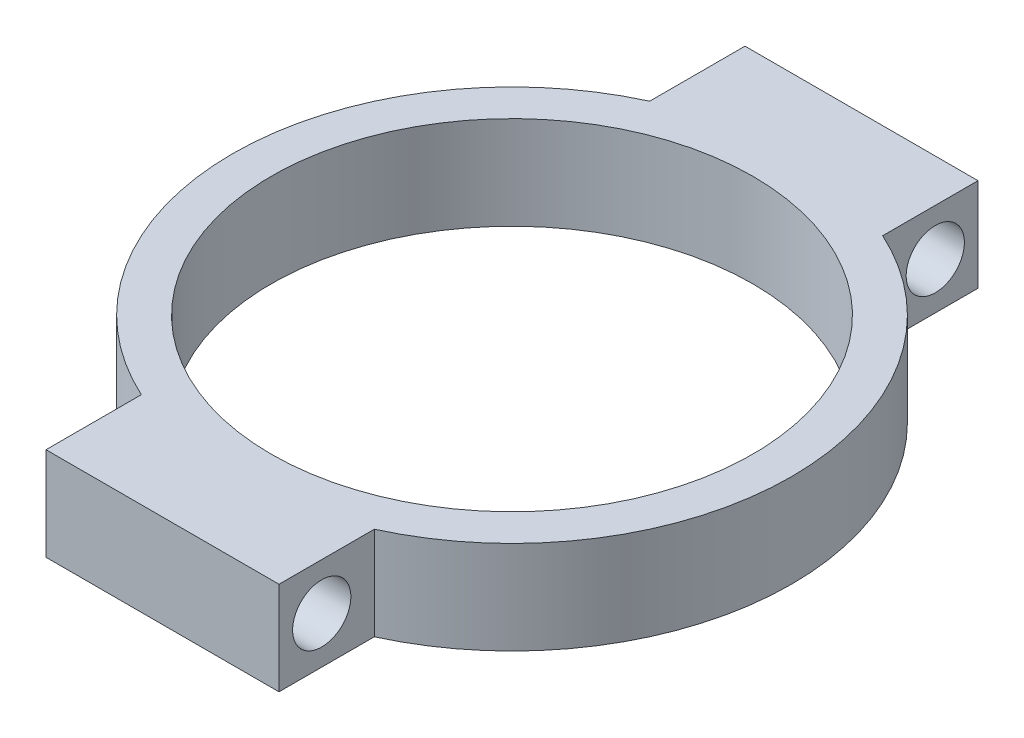
ISO-10303-21;
HEADER;
FILE_DESCRIPTION(('STEP AP214'),'2;1');
FILE_NAME('part.step','',(''),(''),'','','');
FILE_SCHEMA(('AUTOMOTIVE_DESIGN { 1 0 10303 214 1 1 1 1 }'));
ENDSEC;
DATA;
#1=APPLICATION_CONTEXT('core data for automotive mechanical design processes');
#2=APPLICATION_PROTOCOL_DEFINITION('international standard','automotive_design',2000,#1);
#3=PRODUCT_CONTEXT('',#1,'mechanical');
#4=PRODUCT('Part','Part','',(#3));
#5=PRODUCT_RELATED_PRODUCT_CATEGORY('part','',(#4));
#6=PRODUCT_DEFINITION_FORMATION('','',#4);
#7=PRODUCT_DEFINITION_CONTEXT('part definition',#1,'design');
#8=PRODUCT_DEFINITION('design','',#6,#7);
#9=PRODUCT_DEFINITION_SHAPE('','',#8);
#10=(LENGTH_UNIT() NAMED_UNIT(*) SI_UNIT(.MILLI.,.METRE.));
#11=(NAMED_UNIT(*) PLANE_ANGLE_UNIT() SI_UNIT($,.RADIAN.));
#12=(NAMED_UNIT(*) SI_UNIT($,.STERADIAN.) SOLID_ANGLE_UNIT());
#13=UNCERTAINTY_MEASURE_WITH_UNIT(LENGTH_MEASURE(1.E-05),#10,'distance_accuracy_value','');
#14=(GEOMETRIC_REPRESENTATION_CONTEXT(3) GLOBAL_UNCERTAINTY_ASSIGNED_CONTEXT((#13)) GLOBAL_UNIT_ASSIGNED_CONTEXT((#10,
#11,#12)) REPRESENTATION_CONTEXT('',''));
#15=CARTESIAN_POINT('',(0.,0.,0.));
#16=DIRECTION('',(0.,0.,1.));
#17=DIRECTION('',(1.,0.,0.));
#18=AXIS2_PLACEMENT_3D('',#15,#16,#17);
#19=CARTESIAN_POINT('',(0.,15.24,0.));
#20=DIRECTION('',(0.,-1.,0.));
#21=DIRECTION('',(0.,0.,-1.));
#22=AXIS2_PLACEMENT_3D('',#19,#20,#21);
#23=CYLINDRICAL_SURFACE('',#22,45.72);
#24=CARTESIAN_POINT('',(0.,0.,0.));
#25=DIRECTION('',(0.,1.,0.));
#26=DIRECTION('',(0.,0.,1.));
#27=AXIS2_PLACEMENT_3D('',#24,#25,#26);
#28=CIRCLE('',#27,45.72);
#29=CARTESIAN_POINT('',(19.05,0.,-41.5621931567621));
#30=VERTEX_POINT('',#29);
#31=CARTESIAN_POINT('',(19.05,0.,41.5621931567621));
#32=VERTEX_POINT('',#31);
#33=EDGE_CURVE('E132',#30,#32,#28,.F.);
#34=ORIENTED_EDGE('',*,*,#33,.F.);
#35=DIRECTION('',(0.,-1.,0.));
#36=VECTOR('',#35,1.);
#37=CARTESIAN_POINT('',(19.05,15.24,-41.5621931567621));
#38=LINE('',#37,#36);
#39=CARTESIAN_POINT('',(19.05,15.24,-41.5621931567621));
#40=VERTEX_POINT('',#39);
#41=EDGE_CURVE('E11',#40,#30,#38,.T.);
#42=ORIENTED_EDGE('',*,*,#41,.F.);
#43=CARTESIAN_POINT('',(0.,15.24,0.));
#44=DIRECTION('',(0.,1.,0.));
#45=DIRECTION('',(0.,0.,1.));
#46=AXIS2_PLACEMENT_3D('',#43,#44,#45);
#47=CIRCLE('',#46,45.72);
#48=CARTESIAN_POINT('',(19.05,15.24,41.5621931567621));
#49=VERTEX_POINT('',#48);
#50=EDGE_CURVE('E153',#40,#49,#47,.F.);
#51=ORIENTED_EDGE('',*,*,#50,.T.);
#52=DIRECTION('',(0.,-1.,0.));
#53=VECTOR('',#52,1.);
#54=CARTESIAN_POINT('',(19.05,15.24,41.5621931567621));
#55=LINE('',#54,#53);
#56=EDGE_CURVE('E85',#49,#32,#55,.T.);
#57=ORIENTED_EDGE('',*,*,#56,.T.);
#58=EDGE_LOOP('',(#34,#42,#51,#57));
#59=FACE_BOUND('',#58,.T.);
#60=ADVANCED_FACE('F34',(#59),#23,.T.);
#61=CARTESIAN_POINT('',(19.05,15.24,0.));
#62=DIRECTION('',(1.,0.,0.));
#63=DIRECTION('',(0.,0.,-1.));
#64=AXIS2_PLACEMENT_3D('',#61,#62,#63);
#65=PLANE('',#64);
#66=CARTESIAN_POINT('',(19.05,7.61999999999999,-50.165));
#67=DIRECTION('',(1.,0.,0.));
#68=DIRECTION('',(0.,0.,-1.));
#69=AXIS2_PLACEMENT_3D('',#66,#67,#68);
#70=CIRCLE('',#69,4.7625);
#71=CARTESIAN_POINT('',(19.05,7.61999999999999,-54.9275));
#72=VERTEX_POINT('',#71);
#73=EDGE_CURVE('E195',#72,#72,#70,.T.);
#74=ORIENTED_EDGE('',*,*,#73,.F.);
#75=EDGE_LOOP('',(#74));
#76=FACE_BOUND('',#75,.T.);
#77=DIRECTION('',(0.,0.,1.));
#78=VECTOR('',#77,1.);
#79=CARTESIAN_POINT('',(19.05,0.,0.));
#80=LINE('',#79,#78);
#81=CARTESIAN_POINT('',(19.05,0.,-57.15));
#82=VERTEX_POINT('',#81);
#83=EDGE_CURVE('E135',#82,#30,#80,.T.);
#84=ORIENTED_EDGE('',*,*,#83,.F.);
#85=DIRECTION('',(0.,-1.,0.));
#86=VECTOR('',#85,1.);
#87=CARTESIAN_POINT('',(19.05,15.24,-57.15));
#88=LINE('',#87,#86);
#89=CARTESIAN_POINT('',(19.05,15.24,-57.15));
#90=VERTEX_POINT('',#89);
#91=EDGE_CURVE('E43',#90,#82,#88,.T.);
#92=ORIENTED_EDGE('',*,*,#91,.F.);
#93=DIRECTION('',(0.,0.,1.));
#94=VECTOR('',#93,1.);
#95=CARTESIAN_POINT('',(19.05,15.24,0.));
#96=LINE('',#95,#94);
#97=EDGE_CURVE('E187',#90,#40,#96,.T.);
#98=ORIENTED_EDGE('',*,*,#97,.T.);
#99=ORIENTED_EDGE('',*,*,#41,.T.);
#100=EDGE_LOOP('',(#84,#92,#98,#99));
#101=FACE_BOUND('',#100,.T.);
#102=ADVANCED_FACE('F172',(#76,#101),#65,.T.);
#103=CARTESIAN_POINT('',(0.,15.24,-57.15));
#104=DIRECTION('',(0.,0.,-1.));
#105=DIRECTION('',(-1.,0.,0.));
#106=AXIS2_PLACEMENT_3D('',#103,#104,#105);
#107=PLANE('',#106);
#108=DIRECTION('',(1.,0.,0.));
#109=VECTOR('',#108,1.);
#110=CARTESIAN_POINT('',(0.,0.,-57.15));
#111=LINE('',#110,#109);
#112=CARTESIAN_POINT('',(-19.05,0.,-57.15));
#113=VERTEX_POINT('',#112);
#114=EDGE_CURVE('E138',#113,#82,#111,.T.);
#115=ORIENTED_EDGE('',*,*,#114,.F.);
#116=DIRECTION('',(0.,-1.,0.));
#117=VECTOR('',#116,1.);
#118=CARTESIAN_POINT('',(-19.05,15.24,-57.15));
#119=LINE('',#118,#117);
#120=CARTESIAN_POINT('',(-19.05,15.24,-57.15));
#121=VERTEX_POINT('',#120);
#122=EDGE_CURVE('E160',#121,#113,#119,.T.);
#123=ORIENTED_EDGE('',*,*,#122,.F.);
#124=DIRECTION('',(1.,0.,0.));
#125=VECTOR('',#124,1.);
#126=CARTESIAN_POINT('',(0.,15.24,-57.15));
#127=LINE('',#126,#125);
#128=EDGE_CURVE('E168',#121,#90,#127,.T.);
#129=ORIENTED_EDGE('',*,*,#128,.T.);
#130=ORIENTED_EDGE('',*,*,#91,.T.);
#131=EDGE_LOOP('',(#115,#123,#129,#130));
#132=FACE_BOUND('',#131,.T.);
#133=ADVANCED_FACE('F166',(#132),#107,.T.);
#134=CARTESIAN_POINT('',(-19.0499999999999,15.24,0.));
#135=DIRECTION('',(1.,0.,0.));
#136=DIRECTION('',(0.,0.,-1.));
#137=AXIS2_PLACEMENT_3D('',#134,#135,#136);
#138=PLANE('',#137);
#139=CARTESIAN_POINT('',(-19.05,7.61999999999999,-50.165));
#140=DIRECTION('',(-1.,0.,0.));
#141=DIRECTION('',(0.,0.,1.));
#142=AXIS2_PLACEMENT_3D('',#139,#140,#141);
#143=CIRCLE('',#142,4.7625);
#144=CARTESIAN_POINT('',(-19.05,7.61999999999999,-45.4025));
#145=VERTEX_POINT('',#144);
#146=EDGE_CURVE('E198',#145,#145,#143,.T.);
#147=ORIENTED_EDGE('',*,*,#146,.F.);
#148=EDGE_LOOP('',(#147));
#149=FACE_BOUND('',#148,.T.);
#150=DIRECTION('',(0.,0.,1.));
#151=VECTOR('',#150,1.);
#152=CARTESIAN_POINT('',(-19.0499999999999,0.,0.));
#153=LINE('',#152,#151);
#154=CARTESIAN_POINT('',(-19.05,0.,-41.5621931567621));
#155=VERTEX_POINT('',#154);
#156=EDGE_CURVE('E141',#113,#155,#153,.T.);
#157=ORIENTED_EDGE('',*,*,#156,.T.);
#158=DIRECTION('',(0.,-1.,0.));
#159=VECTOR('',#158,1.);
#160=CARTESIAN_POINT('',(-19.05,15.24,-41.5621931567621));
#161=LINE('',#160,#159);
#162=CARTESIAN_POINT('',(-19.05,15.24,-41.5621931567621));
#163=VERTEX_POINT('',#162);
#164=EDGE_CURVE('E157',#163,#155,#161,.T.);
#165=ORIENTED_EDGE('',*,*,#164,.F.);
#166=DIRECTION('',(0.,0.,1.));
#167=VECTOR('',#166,1.);
#168=CARTESIAN_POINT('',(-19.0499999999999,15.24,0.));
#169=LINE('',#168,#167);
#170=EDGE_CURVE('E124',#121,#163,#169,.T.);
#171=ORIENTED_EDGE('',*,*,#170,.F.);
#172=ORIENTED_EDGE('',*,*,#122,.T.);
#173=EDGE_LOOP('',(#157,#165,#171,#172));
#174=FACE_BOUND('',#173,.T.);
#175=ADVANCED_FACE('F180',(#149,#174),#138,.F.);
#176=CARTESIAN_POINT('',(0.,15.24,0.));
#177=DIRECTION('',(0.,-1.,0.));
#178=DIRECTION('',(0.,0.,-1.));
#179=AXIS2_PLACEMENT_3D('',#176,#177,#178);
#180=CYLINDRICAL_SURFACE('',#179,45.72);
#181=CARTESIAN_POINT('',(0.,0.,0.));
#182=DIRECTION('',(0.,1.,0.));
#183=DIRECTION('',(0.,0.,1.));
#184=AXIS2_PLACEMENT_3D('',#181,#182,#183);
#185=CIRCLE('',#184,45.72);
#186=CARTESIAN_POINT('',(-19.05,0.,41.5621931567621));
#187=VERTEX_POINT('',#186);
#188=EDGE_CURVE('E143',#155,#187,#185,.T.);
#189=ORIENTED_EDGE('',*,*,#188,.T.);
#190=DIRECTION('',(0.,-1.,0.));
#191=VECTOR('',#190,1.);
#192=CARTESIAN_POINT('',(-19.05,15.24,41.5621931567621));
#193=LINE('',#192,#191);
#194=CARTESIAN_POINT('',(-19.05,15.24,41.5621931567621));
#195=VERTEX_POINT('',#194);
#196=EDGE_CURVE('E112',#195,#187,#193,.T.);
#197=ORIENTED_EDGE('',*,*,#196,.F.);
#198=CARTESIAN_POINT('',(0.,15.24,0.));
#199=DIRECTION('',(0.,1.,0.));
#200=DIRECTION('',(0.,0.,1.));
#201=AXIS2_PLACEMENT_3D('',#198,#199,#200);
#202=CIRCLE('',#201,45.72);
#203=EDGE_CURVE('E121',#163,#195,#202,.T.);
#204=ORIENTED_EDGE('',*,*,#203,.F.);
#205=ORIENTED_EDGE('',*,*,#164,.T.);
#206=EDGE_LOOP('',(#189,#197,#204,#205));
#207=FACE_BOUND('',#206,.T.);
#208=ADVANCED_FACE('F183',(#207),#180,.T.);
#209=CARTESIAN_POINT('',(-19.05,15.24,0.));
#210=DIRECTION('',(-1.,0.,0.));
#211=DIRECTION('',(0.,0.,1.));
#212=AXIS2_PLACEMENT_3D('',#209,#210,#211);
#213=PLANE('',#212);
#214=CARTESIAN_POINT('',(-19.05,7.62,50.165));
#215=DIRECTION('',(-1.,0.,0.));
#216=DIRECTION('',(0.,0.,1.));
#217=AXIS2_PLACEMENT_3D('',#214,#215,#216);
#218=CIRCLE('',#217,4.7625);
#219=CARTESIAN_POINT('',(-19.05,7.62,54.9275));
#220=VERTEX_POINT('',#219);
#221=EDGE_CURVE('E191',#220,#220,#218,.T.);
#222=ORIENTED_EDGE('',*,*,#221,.F.);
#223=EDGE_LOOP('',(#222));
#224=FACE_BOUND('',#223,.T.);
#225=DIRECTION('',(0.,0.,-1.));
#226=VECTOR('',#225,1.);
#227=CARTESIAN_POINT('',(-19.05,0.,0.));
#228=LINE('',#227,#226);
#229=CARTESIAN_POINT('',(-19.05,0.,57.15));
#230=VERTEX_POINT('',#229);
#231=EDGE_CURVE('E111',#230,#187,#228,.T.);
#232=ORIENTED_EDGE('',*,*,#231,.F.);
#233=DIRECTION('',(0.,-1.,0.));
#234=VECTOR('',#233,1.);
#235=CARTESIAN_POINT('',(-19.05,15.24,57.15));
#236=LINE('',#235,#234);
#237=CARTESIAN_POINT('',(-19.05,15.24,57.15));
#238=VERTEX_POINT('',#237);
#239=EDGE_CURVE('E105',#238,#230,#236,.T.);
#240=ORIENTED_EDGE('',*,*,#239,.F.);
#241=DIRECTION('',(0.,0.,-1.));
#242=VECTOR('',#241,1.);
#243=CARTESIAN_POINT('',(-19.05,15.24,0.));
#244=LINE('',#243,#242);
#245=EDGE_CURVE('E109',#238,#195,#244,.T.);
#246=ORIENTED_EDGE('',*,*,#245,.T.);
#247=ORIENTED_EDGE('',*,*,#196,.T.);
#248=EDGE_LOOP('',(#232,#240,#246,#247));
#249=FACE_BOUND('',#248,.T.);
#250=ADVANCED_FACE('F107',(#224,#249),#213,.T.);
#251=CARTESIAN_POINT('',(0.,15.24,57.15));
#252=DIRECTION('',(0.,0.,-1.));
#253=DIRECTION('',(-1.,0.,0.));
#254=AXIS2_PLACEMENT_3D('',#251,#252,#253);
#255=PLANE('',#254);
#256=DIRECTION('',(1.,0.,0.));
#257=VECTOR('',#256,1.);
#258=CARTESIAN_POINT('',(0.,0.,57.15));
#259=LINE('',#258,#257);
#260=CARTESIAN_POINT('',(19.05,0.,57.15));
#261=VERTEX_POINT('',#260);
#262=EDGE_CURVE('E78',#230,#261,#259,.T.);
#263=ORIENTED_EDGE('',*,*,#262,.T.);
#264=DIRECTION('',(0.,-1.,0.));
#265=VECTOR('',#264,1.);
#266=CARTESIAN_POINT('',(19.05,15.24,57.15));
#267=LINE('',#266,#265);
#268=CARTESIAN_POINT('',(19.05,15.24,57.15));
#269=VERTEX_POINT('',#268);
#270=EDGE_CURVE('E113',#269,#261,#267,.T.);
#271=ORIENTED_EDGE('',*,*,#270,.F.);
#272=DIRECTION('',(1.,0.,0.));
#273=VECTOR('',#272,1.);
#274=CARTESIAN_POINT('',(0.,15.24,57.15));
#275=LINE('',#274,#273);
#276=EDGE_CURVE('E115',#238,#269,#275,.T.);
#277=ORIENTED_EDGE('',*,*,#276,.F.);
#278=ORIENTED_EDGE('',*,*,#239,.T.);
#279=EDGE_LOOP('',(#263,#271,#277,#278));
#280=FACE_BOUND('',#279,.T.);
#281=ADVANCED_FACE('F116',(#280),#255,.F.);
#282=CARTESIAN_POINT('',(19.0499999999999,15.24,0.));
#283=DIRECTION('',(-1.,0.,0.));
#284=DIRECTION('',(0.,0.,1.));
#285=AXIS2_PLACEMENT_3D('',#282,#283,#284);
#286=PLANE('',#285);
#287=CARTESIAN_POINT('',(19.05,7.62,50.165));
#288=DIRECTION('',(-1.,0.,0.));
#289=DIRECTION('',(0.,0.,1.));
#290=AXIS2_PLACEMENT_3D('',#287,#288,#289);
#291=CIRCLE('',#290,4.7625);
#292=CARTESIAN_POINT('',(19.05,7.62,54.9275));
#293=VERTEX_POINT('',#292);
#294=EDGE_CURVE('E37',#293,#293,#291,.T.);
#295=ORIENTED_EDGE('',*,*,#294,.T.);
#296=EDGE_LOOP('',(#295));
#297=FACE_BOUND('',#296,.T.);
#298=DIRECTION('',(0.,0.,-1.));
#299=VECTOR('',#298,1.);
#300=CARTESIAN_POINT('',(19.0499999999999,0.,0.));
#301=LINE('',#300,#299);
#302=EDGE_CURVE('E148',#261,#32,#301,.T.);
#303=ORIENTED_EDGE('',*,*,#302,.T.);
#304=ORIENTED_EDGE('',*,*,#56,.F.);
#305=DIRECTION('',(0.,0.,-1.));
#306=VECTOR('',#305,1.);
#307=CARTESIAN_POINT('',(19.0499999999999,15.24,0.));
#308=LINE('',#307,#306);
#309=EDGE_CURVE('E51',#269,#49,#308,.T.);
#310=ORIENTED_EDGE('',*,*,#309,.F.);
#311=ORIENTED_EDGE('',*,*,#270,.T.);
#312=EDGE_LOOP('',(#303,#304,#310,#311));
#313=FACE_BOUND('',#312,.T.);
#314=ADVANCED_FACE('F186',(#297,#313),#286,.F.);
#315=CARTESIAN_POINT('',(0.,15.24,0.));
#316=DIRECTION('',(0.,-1.,0.));
#317=DIRECTION('',(0.,0.,-1.));
#318=AXIS2_PLACEMENT_3D('',#315,#316,#317);
#319=CYLINDRICAL_SURFACE('',#318,39.37);
#320=CARTESIAN_POINT('',(0.,15.24,0.));
#321=DIRECTION('',(0.,1.,0.));
#322=DIRECTION('',(0.,0.,1.));
#323=AXIS2_PLACEMENT_3D('',#320,#321,#322);
#324=CIRCLE('',#323,39.37);
#325=CARTESIAN_POINT('',(0.,15.24,-39.37));
#326=VERTEX_POINT('',#325);
#327=EDGE_CURVE('E129',#326,#326,#324,.T.);
#328=CARTESIAN_POINT('',(0.,0.,0.));
#329=DIRECTION('',(0.,1.,0.));
#330=DIRECTION('',(0.,0.,1.));
#331=AXIS2_PLACEMENT_3D('',#328,#329,#330);
#332=CIRCLE('',#331,39.37);
#333=CARTESIAN_POINT('',(0.,0.,-39.37));
#334=VERTEX_POINT('',#333);
#335=EDGE_CURVE('E150',#334,#334,#332,.T.);
#336=CARTESIAN_POINT('',(0.,15.24,-39.37));
#337=CARTESIAN_POINT('',(0.,15.08125,-39.37));
#338=CARTESIAN_POINT('',(0.,14.9225,-39.37));
#339=CARTESIAN_POINT('',(0.,14.605,-39.37));
#340=CARTESIAN_POINT('',(0.,14.44625,-39.37));
#341=CARTESIAN_POINT('',(0.,14.12875,-39.37));
#342=CARTESIAN_POINT('',(0.,13.97,-39.37));
#343=CARTESIAN_POINT('',(0.,13.6525,-39.37));
#344=CARTESIAN_POINT('',(0.,13.49375,-39.37));
#345=CARTESIAN_POINT('',(0.,13.17625,-39.37));
#346=CARTESIAN_POINT('',(0.,13.0175,-39.37));
#347=CARTESIAN_POINT('',(0.,12.7,-39.37));
#348=CARTESIAN_POINT('',(0.,12.54125,-39.37));
#349=CARTESIAN_POINT('',(0.,12.22375,-39.37));
#350=CARTESIAN_POINT('',(0.,12.065,-39.37));
#351=CARTESIAN_POINT('',(0.,11.7475,-39.37));
#352=CARTESIAN_POINT('',(0.,11.58875,-39.37));
#353=CARTESIAN_POINT('',(0.,11.27125,-39.37));
#354=CARTESIAN_POINT('',(0.,11.1125,-39.37));
#355=CARTESIAN_POINT('',(0.,10.795,-39.37));
#356=CARTESIAN_POINT('',(0.,10.63625,-39.37));
#357=CARTESIAN_POINT('',(0.,10.31875,-39.37));
#358=CARTESIAN_POINT('',(0.,10.16,-39.37));
#359=CARTESIAN_POINT('',(0.,9.8425,-39.37));
#360=CARTESIAN_POINT('',(0.,9.68375,-39.37));
#361=CARTESIAN_POINT('',(0.,9.36625,-39.37));
#362=CARTESIAN_POINT('',(0.,9.2075,-39.37));
#363=CARTESIAN_POINT('',(0.,8.89,-39.37));
#364=CARTESIAN_POINT('',(0.,8.73125,-39.37));
#365=CARTESIAN_POINT('',(0.,8.41375,-39.37));
#366=CARTESIAN_POINT('',(0.,8.255,-39.37));
#367=CARTESIAN_POINT('',(0.,7.9375,-39.37));
#368=CARTESIAN_POINT('',(0.,7.77875,-39.37));
#369=CARTESIAN_POINT('',(0.,7.46125,-39.37));
#370=CARTESIAN_POINT('',(0.,7.3025,-39.37));
#371=CARTESIAN_POINT('',(0.,6.985,-39.37));
#372=CARTESIAN_POINT('',(0.,6.82625,-39.37));
#373=CARTESIAN_POINT('',(0.,6.50875,-39.37));
#374=CARTESIAN_POINT('',(0.,6.35,-39.37));
#375=CARTESIAN_POINT('',(0.,6.0325,-39.37));
#376=CARTESIAN_POINT('',(0.,5.87375,-39.37));
#377=CARTESIAN_POINT('',(0.,5.55625,-39.37));
#378=CARTESIAN_POINT('',(0.,5.3975,-39.37));
#379=CARTESIAN_POINT('',(0.,5.08,-39.37));
#380=CARTESIAN_POINT('',(0.,4.92125,-39.37));
#381=CARTESIAN_POINT('',(0.,4.60375,-39.37));
#382=CARTESIAN_POINT('',(0.,4.445,-39.37));
#383=CARTESIAN_POINT('',(0.,4.1275,-39.37));
#384=CARTESIAN_POINT('',(0.,3.96875,-39.37));
#385=CARTESIAN_POINT('',(0.,3.65125,-39.37));
#386=CARTESIAN_POINT('',(0.,3.4925,-39.37));
#387=CARTESIAN_POINT('',(0.,3.175,-39.37));
#388=CARTESIAN_POINT('',(0.,3.01625,-39.37));
#389=CARTESIAN_POINT('',(0.,2.69875,-39.37));
#390=CARTESIAN_POINT('',(0.,2.54,-39.37));
#391=CARTESIAN_POINT('',(0.,2.2225,-39.37));
#392=CARTESIAN_POINT('',(0.,2.06375,-39.37));
#393=CARTESIAN_POINT('',(0.,1.74625,-39.37));
#394=CARTESIAN_POINT('',(0.,1.5875,-39.37));
#395=CARTESIAN_POINT('',(0.,1.27,-39.37));
#396=CARTESIAN_POINT('',(0.,1.11125,-39.37));
#397=CARTESIAN_POINT('',(0.,0.79375,-39.37));
#398=CARTESIAN_POINT('',(0.,0.634999999999999,-39.37));
#399=CARTESIAN_POINT('',(0.,0.3175,-39.37));
#400=CARTESIAN_POINT('',(0.,0.15875,-39.37));
#401=CARTESIAN_POINT('',(0.,0.,-39.37));
#402=B_SPLINE_CURVE_WITH_KNOTS('',3,(#336,#337,#338,#339,#340,#341,#342,#343,#344,#345,#346,
#347,#348,#349,#350,#351,#352,#353,#354,#355,#356,#357,#358,#359,#360,#361,#362,#363,#364,#365,
#366,#367,#368,#369,#370,#371,#372,#373,#374,#375,#376,#377,#378,#379,#380,#381,#382,#383,#384,
#385,#386,#387,#388,#389,#390,#391,#392,#393,#394,#395,#396,#397,#398,#399,#400,#401),
.UNSPECIFIED.,.F.,.F.,(4,2,2,2,2,2,2,2,2,2,2,2,2,2,2,2,2,2,2,2,2,2,2,2,2,2,2,2,2,2,2,2,4),(0.,
0.476249999999999,0.952499999999998,1.42875,1.905,2.38125,2.8575,3.33375,3.81,4.28625,4.7625,
5.23875,5.715,6.19125,6.6675,7.14375,7.62,8.09625,8.5725,9.04875,9.525,10.00125,10.4775,
10.95375,11.43,11.90625,12.3825,12.85875,13.335,13.81125,14.2875,14.76375,15.24),.UNSPECIFIED.);
#403=EDGE_CURVE('BSEAM232',#326,#334,#402,.T.);
#404=ORIENTED_EDGE('',*,*,#327,.T.);
#405=ORIENTED_EDGE('',*,*,#335,.F.);
#406=ORIENTED_EDGE('',*,*,#403,.T.);
#407=ORIENTED_EDGE('',*,*,#403,.F.);
#408=EDGE_LOOP('',(#404,#406,#405,#407));
#409=FACE_BOUND('',#408,.T.);
#410=ADVANCED_FACE('F232',(#409),#319,.F.);
#411=CARTESIAN_POINT('',(0.,15.24,0.));
#412=DIRECTION('',(0.,1.,0.));
#413=DIRECTION('',(0.,0.,1.));
#414=AXIS2_PLACEMENT_3D('',#411,#412,#413);
#415=PLANE('',#414);
#416=ORIENTED_EDGE('',*,*,#50,.F.);
#417=ORIENTED_EDGE('',*,*,#97,.F.);
#418=ORIENTED_EDGE('',*,*,#128,.F.);
#419=ORIENTED_EDGE('',*,*,#170,.T.);
#420=ORIENTED_EDGE('',*,*,#203,.T.);
#421=ORIENTED_EDGE('',*,*,#245,.F.);
#422=ORIENTED_EDGE('',*,*,#276,.T.);
#423=ORIENTED_EDGE('',*,*,#309,.T.);
#424=EDGE_LOOP('',(#416,#417,#418,#419,#420,#421,#422,#423));
#425=FACE_BOUND('',#424,.T.);
#426=ORIENTED_EDGE('',*,*,#327,.F.);
#427=EDGE_LOOP('',(#426));
#428=FACE_BOUND('',#427,.T.);
#429=ADVANCED_FACE('F118',(#425,#428),#415,.T.);
#430=CARTESIAN_POINT('',(0.,0.,0.));
#431=DIRECTION('',(0.,1.,0.));
#432=DIRECTION('',(0.,0.,1.));
#433=AXIS2_PLACEMENT_3D('',#430,#431,#432);
#434=PLANE('',#433);
#435=ORIENTED_EDGE('',*,*,#33,.T.);
#436=ORIENTED_EDGE('',*,*,#302,.F.);
#437=ORIENTED_EDGE('',*,*,#262,.F.);
#438=ORIENTED_EDGE('',*,*,#231,.T.);
#439=ORIENTED_EDGE('',*,*,#188,.F.);
#440=ORIENTED_EDGE('',*,*,#156,.F.);
#441=ORIENTED_EDGE('',*,*,#114,.T.);
#442=ORIENTED_EDGE('',*,*,#83,.T.);
#443=EDGE_LOOP('',(#435,#436,#437,#438,#439,#440,#441,#442));
#444=FACE_BOUND('',#443,.T.);
#445=ORIENTED_EDGE('',*,*,#335,.T.);
#446=EDGE_LOOP('',(#445));
#447=FACE_BOUND('',#446,.T.);
#448=ADVANCED_FACE('F175',(#444,#447),#434,.F.);
#449=CARTESIAN_POINT('',(45.72,7.62,50.165));
#450=DIRECTION('',(-1.,0.,0.));
#451=DIRECTION('',(0.,0.,1.));
#452=AXIS2_PLACEMENT_3D('',#449,#450,#451);
#453=CYLINDRICAL_SURFACE('',#452,4.7625);
#454=ORIENTED_EDGE('',*,*,#221,.T.);
#455=EDGE_LOOP('',(#454));
#456=FACE_BOUND('',#455,.T.);
#457=ORIENTED_EDGE('',*,*,#294,.F.);
#458=EDGE_LOOP('',(#457));
#459=FACE_BOUND('',#458,.T.);
#460=ADVANCED_FACE('F222',(#456,#459),#453,.F.);
#461=CARTESIAN_POINT('',(45.72,7.61999999999999,-50.165));
#462=DIRECTION('',(-1.,0.,0.));
#463=DIRECTION('',(0.,0.,1.));
#464=AXIS2_PLACEMENT_3D('',#461,#462,#463);
#465=CYLINDRICAL_SURFACE('',#464,4.7625);
#466=ORIENTED_EDGE('',*,*,#73,.T.);
#467=EDGE_LOOP('',(#466));
#468=FACE_BOUND('',#467,.T.);
#469=ORIENTED_EDGE('',*,*,#146,.T.);
#470=EDGE_LOOP('',(#469));
#471=FACE_BOUND('',#470,.T.);
#472=ADVANCED_FACE('F202',(#468,#471),#465,.F.);
#473=CLOSED_SHELL('',(#60,#102,#133,#175,#208,#250,#281,#314,#410,#429,#448,#460,#472));
#474=MANIFOLD_SOLID_BREP('B2',#473);
#475=ADVANCED_BREP_SHAPE_REPRESENTATION('',(#18,#474),#14);
#476=SHAPE_DEFINITION_REPRESENTATION(#9,#475);
ENDSEC;
END-ISO-10303-21;
